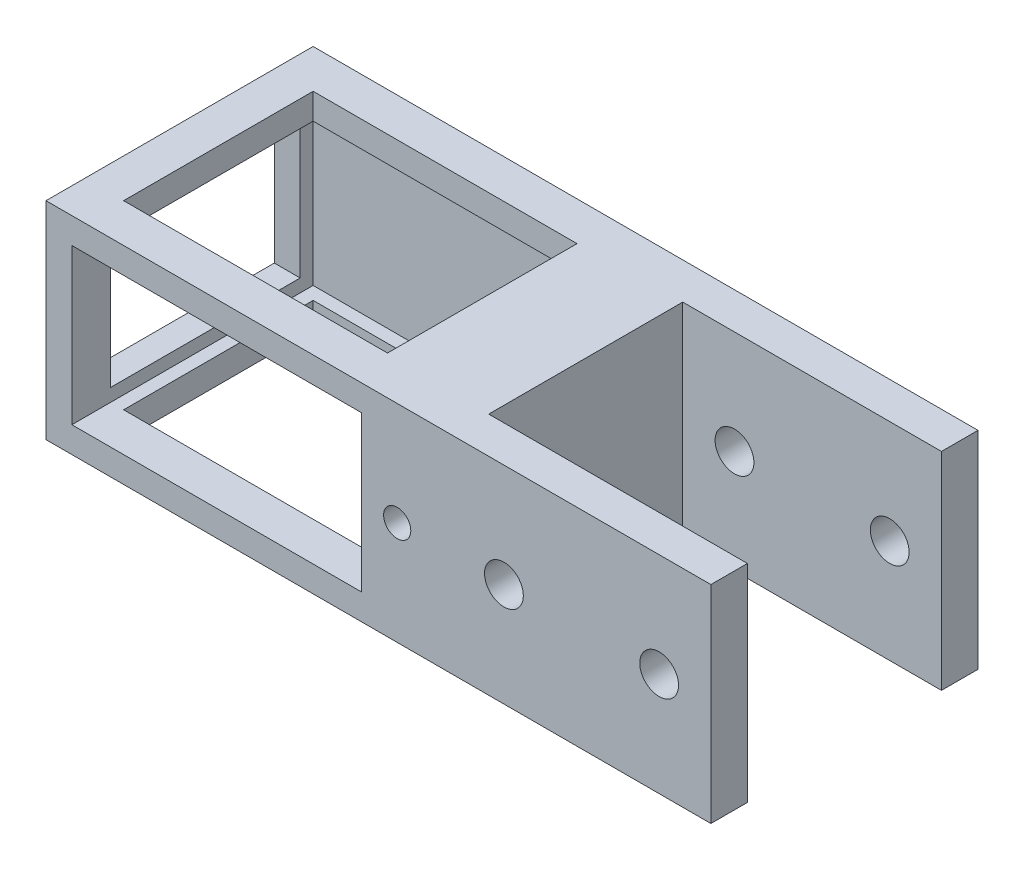
ISO-10303-21;
HEADER;
FILE_DESCRIPTION(('STEP AP214'),'2;1');
FILE_NAME('part.step','',(''),(''),'','','');
FILE_SCHEMA(('AUTOMOTIVE_DESIGN { 1 0 10303 214 1 1 1 1 }'));
ENDSEC;
DATA;
#1=APPLICATION_CONTEXT('core data for automotive mechanical design processes');
#2=APPLICATION_PROTOCOL_DEFINITION('international standard','automotive_design',2000,#1);
#3=PRODUCT_CONTEXT('',#1,'mechanical');
#4=PRODUCT('Part','Part','',(#3));
#5=PRODUCT_RELATED_PRODUCT_CATEGORY('part','',(#4));
#6=PRODUCT_DEFINITION_FORMATION('','',#4);
#7=PRODUCT_DEFINITION_CONTEXT('part definition',#1,'design');
#8=PRODUCT_DEFINITION('design','',#6,#7);
#9=PRODUCT_DEFINITION_SHAPE('','',#8);
#10=(LENGTH_UNIT() NAMED_UNIT(*) SI_UNIT(.MILLI.,.METRE.));
#11=(NAMED_UNIT(*) PLANE_ANGLE_UNIT() SI_UNIT($,.RADIAN.));
#12=(NAMED_UNIT(*) SI_UNIT($,.STERADIAN.) SOLID_ANGLE_UNIT());
#13=UNCERTAINTY_MEASURE_WITH_UNIT(LENGTH_MEASURE(1.E-05),#10,'distance_accuracy_value','');
#14=(GEOMETRIC_REPRESENTATION_CONTEXT(3) GLOBAL_UNCERTAINTY_ASSIGNED_CONTEXT((#13)) GLOBAL_UNIT_ASSIGNED_CONTEXT((#10,
#11,#12)) REPRESENTATION_CONTEXT('',''));
#15=CARTESIAN_POINT('',(0.,0.,0.));
#16=DIRECTION('',(0.,0.,1.));
#17=DIRECTION('',(1.,0.,0.));
#18=AXIS2_PLACEMENT_3D('',#15,#16,#17);
#19=CARTESIAN_POINT('',(18.2,0.,0.));
#20=DIRECTION('',(1.,0.,0.));
#21=DIRECTION('',(0.,0.,-1.));
#22=AXIS2_PLACEMENT_3D('',#19,#20,#21);
#23=PLANE('',#22);
#24=DIRECTION('',(0.,0.,1.));
#25=VECTOR('',#24,1.);
#26=CARTESIAN_POINT('',(18.2,8.,20.65));
#27=LINE('',#26,#25);
#28=CARTESIAN_POINT('',(18.2,8.,2.825));
#29=VERTEX_POINT('',#28);
#30=CARTESIAN_POINT('',(18.2,8.,17.825));
#31=VERTEX_POINT('',#30);
#32=EDGE_CURVE('E59',#29,#31,#27,.T.);
#33=ORIENTED_EDGE('',*,*,#32,.T.);
#34=DIRECTION('',(0.,1.,0.));
#35=VECTOR('',#34,1.);
#36=CARTESIAN_POINT('',(18.2,8.,17.825));
#37=LINE('',#36,#35);
#38=CARTESIAN_POINT('',(18.2,-8.,17.825));
#39=VERTEX_POINT('',#38);
#40=EDGE_CURVE('E54',#39,#31,#37,.T.);
#41=ORIENTED_EDGE('',*,*,#40,.F.);
#42=DIRECTION('',(0.,0.,-1.));
#43=VECTOR('',#42,1.);
#44=CARTESIAN_POINT('',(18.2,-8.,20.65));
#45=LINE('',#44,#43);
#46=CARTESIAN_POINT('',(18.2,-8.,2.825));
#47=VERTEX_POINT('',#46);
#48=EDGE_CURVE('E254',#39,#47,#45,.T.);
#49=ORIENTED_EDGE('',*,*,#48,.T.);
#50=DIRECTION('',(0.,-1.,0.));
#51=VECTOR('',#50,1.);
#52=CARTESIAN_POINT('',(18.2,8.,2.825));
#53=LINE('',#52,#51);
#54=EDGE_CURVE('E235',#29,#47,#53,.T.);
#55=ORIENTED_EDGE('',*,*,#54,.F.);
#56=EDGE_LOOP('',(#33,#41,#49,#55));
#57=FACE_BOUND('',#56,.T.);
#58=ADVANCED_FACE('F37',(#57),#23,.T.);
#59=CARTESIAN_POINT('',(0.,0.,20.65));
#60=DIRECTION('',(0.,0.,1.));
#61=DIRECTION('',(1.,0.,0.));
#62=AXIS2_PLACEMENT_3D('',#59,#60,#61);
#63=PLANE('',#62);
#64=CARTESIAN_POINT('',(34.2,0.,20.65));
#65=DIRECTION('',(0.,0.,1.));
#66=DIRECTION('',(1.,0.,0.));
#67=AXIS2_PLACEMENT_3D('',#64,#65,#66);
#68=CIRCLE('',#67,1.5);
#69=CARTESIAN_POINT('',(35.7,0.,20.65));
#70=VERTEX_POINT('',#69);
#71=EDGE_CURVE('E224',#70,#70,#68,.T.);
#72=ORIENTED_EDGE('',*,*,#71,.F.);
#73=EDGE_LOOP('',(#72));
#74=FACE_BOUND('',#73,.T.);
#75=CARTESIAN_POINT('',(22.2,0.,20.65));
#76=DIRECTION('',(0.,0.,1.));
#77=DIRECTION('',(1.,0.,0.));
#78=AXIS2_PLACEMENT_3D('',#75,#76,#77);
#79=CIRCLE('',#78,1.5);
#80=CARTESIAN_POINT('',(23.7,0.,20.65));
#81=VERTEX_POINT('',#80);
#82=EDGE_CURVE('E413',#81,#81,#79,.T.);
#83=ORIENTED_EDGE('',*,*,#82,.F.);
#84=EDGE_LOOP('',(#83));
#85=FACE_BOUND('',#84,.T.);
#86=CARTESIAN_POINT('',(13.95,0.,20.65));
#87=DIRECTION('',(0.,0.,1.));
#88=DIRECTION('',(1.,0.,0.));
#89=AXIS2_PLACEMENT_3D('',#86,#87,#88);
#90=CIRCLE('',#89,1.05);
#91=CARTESIAN_POINT('',(15.,0.,20.65));
#92=VERTEX_POINT('',#91);
#93=EDGE_CURVE('E263',#92,#92,#90,.T.);
#94=ORIENTED_EDGE('',*,*,#93,.F.);
#95=EDGE_LOOP('',(#94));
#96=FACE_BOUND('',#95,.T.);
#97=DIRECTION('',(0.,1.,0.));
#98=VECTOR('',#97,1.);
#99=CARTESIAN_POINT('',(11.2,6.,20.65));
#100=LINE('',#99,#98);
#101=CARTESIAN_POINT('',(11.2,-6.,20.65));
#102=VERTEX_POINT('',#101);
#103=CARTESIAN_POINT('',(11.2,6.,20.65));
#104=VERTEX_POINT('',#103);
#105=EDGE_CURVE('E337',#102,#104,#100,.T.);
#106=ORIENTED_EDGE('',*,*,#105,.F.);
#107=DIRECTION('',(1.,0.,0.));
#108=VECTOR('',#107,1.);
#109=CARTESIAN_POINT('',(-11.2,-6.,20.65));
#110=LINE('',#109,#108);
#111=CARTESIAN_POINT('',(-11.2,-6.,20.65));
#112=VERTEX_POINT('',#111);
#113=EDGE_CURVE('E342',#112,#102,#110,.T.);
#114=ORIENTED_EDGE('',*,*,#113,.F.);
#115=DIRECTION('',(0.,-1.,0.));
#116=VECTOR('',#115,1.);
#117=CARTESIAN_POINT('',(-11.2,6.,20.65));
#118=LINE('',#117,#116);
#119=CARTESIAN_POINT('',(-11.2,6.,20.65));
#120=VERTEX_POINT('',#119);
#121=EDGE_CURVE('E356',#120,#112,#118,.T.);
#122=ORIENTED_EDGE('',*,*,#121,.F.);
#123=DIRECTION('',(-1.,0.,0.));
#124=VECTOR('',#123,1.);
#125=CARTESIAN_POINT('',(-11.2,6.,20.65));
#126=LINE('',#125,#124);
#127=EDGE_CURVE('E353',#104,#120,#126,.T.);
#128=ORIENTED_EDGE('',*,*,#127,.F.);
#129=EDGE_LOOP('',(#106,#114,#122,#128));
#130=FACE_BOUND('',#129,.T.);
#131=DIRECTION('',(1.,0.,0.));
#132=VECTOR('',#131,1.);
#133=CARTESIAN_POINT('',(-13.2,-8.,20.65));
#134=LINE('',#133,#132);
#135=CARTESIAN_POINT('',(-13.2,-8.,20.65));
#136=VERTEX_POINT('',#135);
#137=CARTESIAN_POINT('',(38.2,-8.,20.65));
#138=VERTEX_POINT('',#137);
#139=EDGE_CURVE('E198',#136,#138,#134,.T.);
#140=ORIENTED_EDGE('',*,*,#139,.T.);
#141=DIRECTION('',(0.,-1.,0.));
#142=VECTOR('',#141,1.);
#143=CARTESIAN_POINT('',(38.2,8.,20.65));
#144=LINE('',#143,#142);
#145=CARTESIAN_POINT('',(38.2,8.,20.65));
#146=VERTEX_POINT('',#145);
#147=EDGE_CURVE('E202',#146,#138,#144,.T.);
#148=ORIENTED_EDGE('',*,*,#147,.F.);
#149=DIRECTION('',(-1.,0.,0.));
#150=VECTOR('',#149,1.);
#151=CARTESIAN_POINT('',(-13.2,8.,20.65));
#152=LINE('',#151,#150);
#153=CARTESIAN_POINT('',(-13.2,8.,20.65));
#154=VERTEX_POINT('',#153);
#155=EDGE_CURVE('E370',#146,#154,#152,.T.);
#156=ORIENTED_EDGE('',*,*,#155,.T.);
#157=DIRECTION('',(0.,-1.,0.));
#158=VECTOR('',#157,1.);
#159=CARTESIAN_POINT('',(-13.2,8.,20.65));
#160=LINE('',#159,#158);
#161=EDGE_CURVE('E204',#154,#136,#160,.T.);
#162=ORIENTED_EDGE('',*,*,#161,.T.);
#163=EDGE_LOOP('',(#140,#148,#156,#162));
#164=FACE_BOUND('',#163,.T.);
#165=ADVANCED_FACE('F200',(#74,#85,#96,#130,#164),#63,.T.);
#166=CARTESIAN_POINT('',(0.,0.,0.));
#167=DIRECTION('',(0.,0.,1.));
#168=DIRECTION('',(1.,0.,0.));
#169=AXIS2_PLACEMENT_3D('',#166,#167,#168);
#170=PLANE('',#169);
#171=CARTESIAN_POINT('',(34.2,0.,0.));
#172=DIRECTION('',(0.,0.,-1.));
#173=DIRECTION('',(-1.,0.,0.));
#174=AXIS2_PLACEMENT_3D('',#171,#172,#173);
#175=CIRCLE('',#174,1.5);
#176=CARTESIAN_POINT('',(32.7,0.,0.));
#177=VERTEX_POINT('',#176);
#178=EDGE_CURVE('E409',#177,#177,#175,.T.);
#179=ORIENTED_EDGE('',*,*,#178,.F.);
#180=EDGE_LOOP('',(#179));
#181=FACE_BOUND('',#180,.T.);
#182=CARTESIAN_POINT('',(22.2,0.,0.));
#183=DIRECTION('',(0.,0.,-1.));
#184=DIRECTION('',(-1.,0.,0.));
#185=AXIS2_PLACEMENT_3D('',#182,#183,#184);
#186=CIRCLE('',#185,1.5);
#187=CARTESIAN_POINT('',(20.7,0.,0.));
#188=VERTEX_POINT('',#187);
#189=EDGE_CURVE('E416',#188,#188,#186,.T.);
#190=ORIENTED_EDGE('',*,*,#189,.F.);
#191=EDGE_LOOP('',(#190));
#192=FACE_BOUND('',#191,.T.);
#193=CARTESIAN_POINT('',(-5.2,0.,0.));
#194=DIRECTION('',(0.,0.,1.));
#195=DIRECTION('',(1.,0.,0.));
#196=AXIS2_PLACEMENT_3D('',#193,#194,#195);
#197=CIRCLE('',#196,5.);
#198=CARTESIAN_POINT('',(-0.2,0.,0.));
#199=VERTEX_POINT('',#198);
#200=EDGE_CURVE('E46',#199,#199,#197,.F.);
#201=ORIENTED_EDGE('',*,*,#200,.F.);
#202=EDGE_LOOP('',(#201));
#203=FACE_BOUND('',#202,.T.);
#204=DIRECTION('',(-1.,0.,0.));
#205=VECTOR('',#204,1.);
#206=CARTESIAN_POINT('',(-13.2,8.,0.));
#207=LINE('',#206,#205);
#208=CARTESIAN_POINT('',(38.2,8.,0.));
#209=VERTEX_POINT('',#208);
#210=CARTESIAN_POINT('',(-13.2,8.,0.));
#211=VERTEX_POINT('',#210);
#212=EDGE_CURVE('E363',#209,#211,#207,.T.);
#213=ORIENTED_EDGE('',*,*,#212,.F.);
#214=DIRECTION('',(0.,1.,0.));
#215=VECTOR('',#214,1.);
#216=CARTESIAN_POINT('',(38.2,8.,0.));
#217=LINE('',#216,#215);
#218=CARTESIAN_POINT('',(38.2,-8.,0.));
#219=VERTEX_POINT('',#218);
#220=EDGE_CURVE('E236',#219,#209,#217,.T.);
#221=ORIENTED_EDGE('',*,*,#220,.F.);
#222=DIRECTION('',(1.,0.,0.));
#223=VECTOR('',#222,1.);
#224=CARTESIAN_POINT('',(-13.2,-8.,0.));
#225=LINE('',#224,#223);
#226=CARTESIAN_POINT('',(-13.2,-8.,0.));
#227=VERTEX_POINT('',#226);
#228=EDGE_CURVE('E372',#227,#219,#225,.T.);
#229=ORIENTED_EDGE('',*,*,#228,.F.);
#230=DIRECTION('',(0.,-1.,0.));
#231=VECTOR('',#230,1.);
#232=CARTESIAN_POINT('',(-13.2,8.,0.));
#233=LINE('',#232,#231);
#234=EDGE_CURVE('E375',#211,#227,#233,.T.);
#235=ORIENTED_EDGE('',*,*,#234,.F.);
#236=EDGE_LOOP('',(#213,#221,#229,#235));
#237=FACE_BOUND('',#236,.T.);
#238=ADVANCED_FACE('F454',(#181,#192,#203,#237),#170,.F.);
#239=CARTESIAN_POINT('',(-13.2,8.,20.65));
#240=DIRECTION('',(0.,-1.,0.));
#241=DIRECTION('',(0.,0.,-1.));
#242=AXIS2_PLACEMENT_3D('',#239,#240,#241);
#243=PLANE('',#242);
#244=DIRECTION('',(-1.,0.,0.));
#245=VECTOR('',#244,1.);
#246=CARTESIAN_POINT('',(10.2,8.,3.));
#247=LINE('',#246,#245);
#248=CARTESIAN_POINT('',(10.2,8.,3.));
#249=VERTEX_POINT('',#248);
#250=CARTESIAN_POINT('',(-10.2,8.,3.00000000000001));
#251=VERTEX_POINT('',#250);
#252=EDGE_CURVE('E291',#249,#251,#247,.T.);
#253=ORIENTED_EDGE('',*,*,#252,.F.);
#254=DIRECTION('',(0.,0.,-1.));
#255=VECTOR('',#254,1.);
#256=CARTESIAN_POINT('',(10.2,8.,17.65));
#257=LINE('',#256,#255);
#258=CARTESIAN_POINT('',(10.2,8.,17.65));
#259=VERTEX_POINT('',#258);
#260=EDGE_CURVE('E283',#259,#249,#257,.T.);
#261=ORIENTED_EDGE('',*,*,#260,.F.);
#262=DIRECTION('',(1.,0.,0.));
#263=VECTOR('',#262,1.);
#264=CARTESIAN_POINT('',(10.2,8.,17.65));
#265=LINE('',#264,#263);
#266=CARTESIAN_POINT('',(-10.2,8.,17.65));
#267=VERTEX_POINT('',#266);
#268=EDGE_CURVE('E297',#267,#259,#265,.T.);
#269=ORIENTED_EDGE('',*,*,#268,.F.);
#270=DIRECTION('',(0.,0.,1.));
#271=VECTOR('',#270,1.);
#272=CARTESIAN_POINT('',(-10.2,8.,17.65));
#273=LINE('',#272,#271);
#274=EDGE_CURVE('E294',#251,#267,#273,.T.);
#275=ORIENTED_EDGE('',*,*,#274,.F.);
#276=EDGE_LOOP('',(#253,#261,#269,#275));
#277=FACE_BOUND('',#276,.T.);
#278=ORIENTED_EDGE('',*,*,#32,.F.);
#279=DIRECTION('',(-1.,0.,0.));
#280=VECTOR('',#279,1.);
#281=CARTESIAN_POINT('',(38.2,8.,2.825));
#282=LINE('',#281,#280);
#283=CARTESIAN_POINT('',(38.2,8.,2.825));
#284=VERTEX_POINT('',#283);
#285=EDGE_CURVE('E251',#284,#29,#282,.T.);
#286=ORIENTED_EDGE('',*,*,#285,.F.);
#287=DIRECTION('',(0.,0.,1.));
#288=VECTOR('',#287,1.);
#289=CARTESIAN_POINT('',(38.2,8.,0.));
#290=LINE('',#289,#288);
#291=EDGE_CURVE('E239',#209,#284,#290,.T.);
#292=ORIENTED_EDGE('',*,*,#291,.F.);
#293=ORIENTED_EDGE('',*,*,#212,.T.);
#294=DIRECTION('',(0.,0.,-1.));
#295=VECTOR('',#294,1.);
#296=CARTESIAN_POINT('',(-13.2,8.,20.65));
#297=LINE('',#296,#295);
#298=EDGE_CURVE('E379',#154,#211,#297,.T.);
#299=ORIENTED_EDGE('',*,*,#298,.F.);
#300=ORIENTED_EDGE('',*,*,#155,.F.);
#301=DIRECTION('',(0.,0.,1.));
#302=VECTOR('',#301,1.);
#303=CARTESIAN_POINT('',(38.2,8.,20.65));
#304=LINE('',#303,#302);
#305=CARTESIAN_POINT('',(38.2,8.,17.825));
#306=VERTEX_POINT('',#305);
#307=EDGE_CURVE('E222',#306,#146,#304,.T.);
#308=ORIENTED_EDGE('',*,*,#307,.F.);
#309=DIRECTION('',(-1.,0.,0.));
#310=VECTOR('',#309,1.);
#311=CARTESIAN_POINT('',(38.2,8.,17.825));
#312=LINE('',#311,#310);
#313=EDGE_CURVE('E230',#306,#31,#312,.T.);
#314=ORIENTED_EDGE('',*,*,#313,.T.);
#315=EDGE_LOOP('',(#278,#286,#292,#293,#299,#300,#308,#314));
#316=FACE_BOUND('',#315,.T.);
#317=ADVANCED_FACE('F39',(#277,#316),#243,.F.);
#318=CARTESIAN_POINT('',(-13.2,-8.,20.65));
#319=DIRECTION('',(0.,1.,0.));
#320=DIRECTION('',(0.,0.,1.));
#321=AXIS2_PLACEMENT_3D('',#318,#319,#320);
#322=PLANE('',#321);
#323=DIRECTION('',(1.,0.,0.));
#324=VECTOR('',#323,1.);
#325=CARTESIAN_POINT('',(-13.2,-8.,17.65));
#326=LINE('',#325,#324);
#327=CARTESIAN_POINT('',(-10.2,-8.,17.65));
#328=VERTEX_POINT('',#327);
#329=CARTESIAN_POINT('',(10.2,-8.,17.65));
#330=VERTEX_POINT('',#329);
#331=EDGE_CURVE('E328',#328,#330,#326,.T.);
#332=ORIENTED_EDGE('',*,*,#331,.T.);
#333=DIRECTION('',(0.,0.,-1.));
#334=VECTOR('',#333,1.);
#335=CARTESIAN_POINT('',(10.2,-8.,20.65));
#336=LINE('',#335,#334);
#337=CARTESIAN_POINT('',(10.2,-8.,3.));
#338=VERTEX_POINT('',#337);
#339=EDGE_CURVE('E334',#330,#338,#336,.T.);
#340=ORIENTED_EDGE('',*,*,#339,.T.);
#341=DIRECTION('',(-1.,0.,0.));
#342=VECTOR('',#341,1.);
#343=CARTESIAN_POINT('',(-13.2,-8.,3.00000000000001));
#344=LINE('',#343,#342);
#345=CARTESIAN_POINT('',(-10.2,-8.,3.00000000000001));
#346=VERTEX_POINT('',#345);
#347=EDGE_CURVE('E316',#338,#346,#344,.T.);
#348=ORIENTED_EDGE('',*,*,#347,.T.);
#349=DIRECTION('',(0.,0.,1.));
#350=VECTOR('',#349,1.);
#351=CARTESIAN_POINT('',(-10.2,-8.,20.65));
#352=LINE('',#351,#350);
#353=EDGE_CURVE('E322',#346,#328,#352,.T.);
#354=ORIENTED_EDGE('',*,*,#353,.T.);
#355=EDGE_LOOP('',(#332,#340,#348,#354));
#356=FACE_BOUND('',#355,.T.);
#357=ORIENTED_EDGE('',*,*,#48,.F.);
#358=DIRECTION('',(-1.,0.,0.));
#359=VECTOR('',#358,1.);
#360=CARTESIAN_POINT('',(38.2,-8.,17.825));
#361=LINE('',#360,#359);
#362=CARTESIAN_POINT('',(38.2,-8.,17.825));
#363=VERTEX_POINT('',#362);
#364=EDGE_CURVE('E214',#363,#39,#361,.T.);
#365=ORIENTED_EDGE('',*,*,#364,.F.);
#366=DIRECTION('',(0.,0.,-1.));
#367=VECTOR('',#366,1.);
#368=CARTESIAN_POINT('',(38.2,-8.,20.65));
#369=LINE('',#368,#367);
#370=EDGE_CURVE('E211',#138,#363,#369,.T.);
#371=ORIENTED_EDGE('',*,*,#370,.F.);
#372=ORIENTED_EDGE('',*,*,#139,.F.);
#373=DIRECTION('',(0.,0.,-1.));
#374=VECTOR('',#373,1.);
#375=CARTESIAN_POINT('',(-13.2,-8.,20.65));
#376=LINE('',#375,#374);
#377=EDGE_CURVE('E208',#136,#227,#376,.T.);
#378=ORIENTED_EDGE('',*,*,#377,.T.);
#379=ORIENTED_EDGE('',*,*,#228,.T.);
#380=DIRECTION('',(0.,0.,-1.));
#381=VECTOR('',#380,1.);
#382=CARTESIAN_POINT('',(38.2,-8.,0.));
#383=LINE('',#382,#381);
#384=CARTESIAN_POINT('',(38.2,-8.,2.825));
#385=VERTEX_POINT('',#384);
#386=EDGE_CURVE('E243',#385,#219,#383,.T.);
#387=ORIENTED_EDGE('',*,*,#386,.F.);
#388=DIRECTION('',(-1.,0.,0.));
#389=VECTOR('',#388,1.);
#390=CARTESIAN_POINT('',(38.2,-8.,2.825));
#391=LINE('',#390,#389);
#392=EDGE_CURVE('E246',#385,#47,#391,.T.);
#393=ORIENTED_EDGE('',*,*,#392,.T.);
#394=EDGE_LOOP('',(#357,#365,#371,#372,#378,#379,#387,#393));
#395=FACE_BOUND('',#394,.T.);
#396=ADVANCED_FACE('F212',(#356,#395),#322,.F.);
#397=CARTESIAN_POINT('',(-13.2,8.,20.65));
#398=DIRECTION('',(1.,0.,0.));
#399=DIRECTION('',(0.,1.,0.));
#400=AXIS2_PLACEMENT_3D('',#397,#398,#399);
#401=PLANE('',#400);
#402=DIRECTION('',(0.,0.,1.));
#403=VECTOR('',#402,1.);
#404=CARTESIAN_POINT('',(-13.2,-5.,0.));
#405=LINE('',#404,#403);
#406=CARTESIAN_POINT('',(-13.2,-5.,3.));
#407=VERTEX_POINT('',#406);
#408=CARTESIAN_POINT('',(-13.2,-5.,17.65));
#409=VERTEX_POINT('',#408);
#410=EDGE_CURVE('E271',#407,#409,#405,.T.);
#411=ORIENTED_EDGE('',*,*,#410,.F.);
#412=DIRECTION('',(0.,-1.,0.));
#413=VECTOR('',#412,1.);
#414=CARTESIAN_POINT('',(-13.2,0.,3.));
#415=LINE('',#414,#413);
#416=CARTESIAN_POINT('',(-13.2,5.,3.));
#417=VERTEX_POINT('',#416);
#418=EDGE_CURVE('E267',#417,#407,#415,.T.);
#419=ORIENTED_EDGE('',*,*,#418,.F.);
#420=DIRECTION('',(0.,0.,1.));
#421=VECTOR('',#420,1.);
#422=CARTESIAN_POINT('',(-13.2,5.,0.));
#423=LINE('',#422,#421);
#424=CARTESIAN_POINT('',(-13.2,5.,17.65));
#425=VERTEX_POINT('',#424);
#426=EDGE_CURVE('E277',#417,#425,#423,.T.);
#427=ORIENTED_EDGE('',*,*,#426,.T.);
#428=DIRECTION('',(0.,-1.,0.));
#429=VECTOR('',#428,1.);
#430=CARTESIAN_POINT('',(-13.2,0.,17.65));
#431=LINE('',#430,#429);
#432=EDGE_CURVE('E274',#425,#409,#431,.T.);
#433=ORIENTED_EDGE('',*,*,#432,.T.);
#434=EDGE_LOOP('',(#411,#419,#427,#433));
#435=FACE_BOUND('',#434,.T.);
#436=ORIENTED_EDGE('',*,*,#234,.T.);
#437=ORIENTED_EDGE('',*,*,#377,.F.);
#438=ORIENTED_EDGE('',*,*,#161,.F.);
#439=ORIENTED_EDGE('',*,*,#298,.T.);
#440=EDGE_LOOP('',(#436,#437,#438,#439));
#441=FACE_BOUND('',#440,.T.);
#442=ADVANCED_FACE('F539',(#435,#441),#401,.F.);
#443=CARTESIAN_POINT('',(11.2,6.,2.));
#444=DIRECTION('',(1.,0.,0.));
#445=DIRECTION('',(0.,0.,-1.));
#446=AXIS2_PLACEMENT_3D('',#443,#444,#445);
#447=PLANE('',#446);
#448=ORIENTED_EDGE('',*,*,#105,.T.);
#449=DIRECTION('',(0.,0.,1.));
#450=VECTOR('',#449,1.);
#451=CARTESIAN_POINT('',(11.2,6.,2.));
#452=LINE('',#451,#450);
#453=CARTESIAN_POINT('',(11.2,6.,2.));
#454=VERTEX_POINT('',#453);
#455=EDGE_CURVE('E351',#454,#104,#452,.T.);
#456=ORIENTED_EDGE('',*,*,#455,.F.);
#457=DIRECTION('',(0.,1.,0.));
#458=VECTOR('',#457,1.);
#459=CARTESIAN_POINT('',(11.2,6.,2.));
#460=LINE('',#459,#458);
#461=CARTESIAN_POINT('',(11.2,-6.,2.));
#462=VERTEX_POINT('',#461);
#463=EDGE_CURVE('E338',#462,#454,#460,.T.);
#464=ORIENTED_EDGE('',*,*,#463,.F.);
#465=DIRECTION('',(0.,0.,1.));
#466=VECTOR('',#465,1.);
#467=CARTESIAN_POINT('',(11.2,-6.,2.));
#468=LINE('',#467,#466);
#469=EDGE_CURVE('E361',#462,#102,#468,.T.);
#470=ORIENTED_EDGE('',*,*,#469,.T.);
#471=EDGE_LOOP('',(#448,#456,#464,#470));
#472=FACE_BOUND('',#471,.T.);
#473=ADVANCED_FACE('F530',(#472),#447,.F.);
#474=CARTESIAN_POINT('',(-11.2,-6.,2.));
#475=DIRECTION('',(0.,-1.,0.));
#476=DIRECTION('',(0.,0.,-1.));
#477=AXIS2_PLACEMENT_3D('',#474,#475,#476);
#478=PLANE('',#477);
#479=DIRECTION('',(1.,0.,0.));
#480=VECTOR('',#479,1.);
#481=CARTESIAN_POINT('',(-11.2,-6.,3.00000000000001));
#482=LINE('',#481,#480);
#483=CARTESIAN_POINT('',(-10.2,-6.,3.00000000000001));
#484=VERTEX_POINT('',#483);
#485=CARTESIAN_POINT('',(10.2,-6.,3.));
#486=VERTEX_POINT('',#485);
#487=EDGE_CURVE('E313',#484,#486,#482,.T.);
#488=ORIENTED_EDGE('',*,*,#487,.T.);
#489=DIRECTION('',(0.,0.,1.));
#490=VECTOR('',#489,1.);
#491=CARTESIAN_POINT('',(10.2,-6.,2.));
#492=LINE('',#491,#490);
#493=CARTESIAN_POINT('',(10.2,-6.,17.65));
#494=VERTEX_POINT('',#493);
#495=EDGE_CURVE('E331',#486,#494,#492,.T.);
#496=ORIENTED_EDGE('',*,*,#495,.T.);
#497=DIRECTION('',(-1.,0.,0.));
#498=VECTOR('',#497,1.);
#499=CARTESIAN_POINT('',(-11.2,-6.,17.65));
#500=LINE('',#499,#498);
#501=CARTESIAN_POINT('',(-10.2,-6.,17.65));
#502=VERTEX_POINT('',#501);
#503=EDGE_CURVE('E325',#494,#502,#500,.T.);
#504=ORIENTED_EDGE('',*,*,#503,.T.);
#505=DIRECTION('',(0.,0.,-1.));
#506=VECTOR('',#505,1.);
#507=CARTESIAN_POINT('',(-10.2,-6.,2.));
#508=LINE('',#507,#506);
#509=EDGE_CURVE('E319',#502,#484,#508,.T.);
#510=ORIENTED_EDGE('',*,*,#509,.T.);
#511=EDGE_LOOP('',(#488,#496,#504,#510));
#512=FACE_BOUND('',#511,.T.);
#513=ORIENTED_EDGE('',*,*,#113,.T.);
#514=ORIENTED_EDGE('',*,*,#469,.F.);
#515=DIRECTION('',(1.,0.,0.));
#516=VECTOR('',#515,1.);
#517=CARTESIAN_POINT('',(-11.2,-6.,2.));
#518=LINE('',#517,#516);
#519=CARTESIAN_POINT('',(-11.2,-6.,2.));
#520=VERTEX_POINT('',#519);
#521=EDGE_CURVE('E348',#520,#462,#518,.T.);
#522=ORIENTED_EDGE('',*,*,#521,.F.);
#523=DIRECTION('',(0.,0.,1.));
#524=VECTOR('',#523,1.);
#525=CARTESIAN_POINT('',(-11.2,-6.,2.));
#526=LINE('',#525,#524);
#527=EDGE_CURVE('E364',#520,#112,#526,.T.);
#528=ORIENTED_EDGE('',*,*,#527,.T.);
#529=EDGE_LOOP('',(#513,#514,#522,#528));
#530=FACE_BOUND('',#529,.T.);
#531=ADVANCED_FACE('F526',(#512,#530),#478,.F.);
#532=CARTESIAN_POINT('',(-11.2,6.,2.));
#533=DIRECTION('',(-1.,0.,0.));
#534=DIRECTION('',(0.,-1.,0.));
#535=AXIS2_PLACEMENT_3D('',#532,#533,#534);
#536=PLANE('',#535);
#537=DIRECTION('',(0.,0.,1.));
#538=VECTOR('',#537,1.);
#539=CARTESIAN_POINT('',(-11.2,5.,2.));
#540=LINE('',#539,#538);
#541=CARTESIAN_POINT('',(-11.2,5.,3.));
#542=VERTEX_POINT('',#541);
#543=CARTESIAN_POINT('',(-11.2,5.,17.65));
#544=VERTEX_POINT('',#543);
#545=EDGE_CURVE('E400',#542,#544,#540,.T.);
#546=ORIENTED_EDGE('',*,*,#545,.F.);
#547=DIRECTION('',(0.,-1.,0.));
#548=VECTOR('',#547,1.);
#549=CARTESIAN_POINT('',(-11.2,6.,3.));
#550=LINE('',#549,#548);
#551=CARTESIAN_POINT('',(-11.2,-5.,3.));
#552=VERTEX_POINT('',#551);
#553=EDGE_CURVE('E402',#542,#552,#550,.T.);
#554=ORIENTED_EDGE('',*,*,#553,.T.);
#555=DIRECTION('',(0.,0.,1.));
#556=VECTOR('',#555,1.);
#557=CARTESIAN_POINT('',(-11.2,-5.,2.));
#558=LINE('',#557,#556);
#559=CARTESIAN_POINT('',(-11.2,-5.,17.65));
#560=VERTEX_POINT('',#559);
#561=EDGE_CURVE('E394',#552,#560,#558,.T.);
#562=ORIENTED_EDGE('',*,*,#561,.T.);
#563=DIRECTION('',(0.,-1.,0.));
#564=VECTOR('',#563,1.);
#565=CARTESIAN_POINT('',(-11.2,6.,17.65));
#566=LINE('',#565,#564);
#567=EDGE_CURVE('E397',#544,#560,#566,.T.);
#568=ORIENTED_EDGE('',*,*,#567,.F.);
#569=EDGE_LOOP('',(#546,#554,#562,#568));
#570=FACE_BOUND('',#569,.T.);
#571=ORIENTED_EDGE('',*,*,#121,.T.);
#572=ORIENTED_EDGE('',*,*,#527,.F.);
#573=DIRECTION('',(0.,-1.,0.));
#574=VECTOR('',#573,1.);
#575=CARTESIAN_POINT('',(-11.2,6.,2.));
#576=LINE('',#575,#574);
#577=CARTESIAN_POINT('',(-11.2,6.,2.));
#578=VERTEX_POINT('',#577);
#579=EDGE_CURVE('E345',#578,#520,#576,.T.);
#580=ORIENTED_EDGE('',*,*,#579,.F.);
#581=DIRECTION('',(0.,0.,1.));
#582=VECTOR('',#581,1.);
#583=CARTESIAN_POINT('',(-11.2,6.,2.));
#584=LINE('',#583,#582);
#585=EDGE_CURVE('E366',#578,#120,#584,.T.);
#586=ORIENTED_EDGE('',*,*,#585,.T.);
#587=EDGE_LOOP('',(#571,#572,#580,#586));
#588=FACE_BOUND('',#587,.T.);
#589=ADVANCED_FACE('F529',(#570,#588),#536,.F.);
#590=CARTESIAN_POINT('',(-11.2,6.,2.));
#591=DIRECTION('',(0.,1.,0.));
#592=DIRECTION('',(0.,0.,1.));
#593=AXIS2_PLACEMENT_3D('',#590,#591,#592);
#594=PLANE('',#593);
#595=DIRECTION('',(1.,0.,0.));
#596=VECTOR('',#595,1.);
#597=CARTESIAN_POINT('',(-11.2,6.,17.65));
#598=LINE('',#597,#596);
#599=CARTESIAN_POINT('',(-10.2,6.,17.65));
#600=VERTEX_POINT('',#599);
#601=CARTESIAN_POINT('',(10.2,6.,17.65));
#602=VERTEX_POINT('',#601);
#603=EDGE_CURVE('E388',#600,#602,#598,.T.);
#604=ORIENTED_EDGE('',*,*,#603,.T.);
#605=DIRECTION('',(0.,0.,-1.));
#606=VECTOR('',#605,1.);
#607=CARTESIAN_POINT('',(10.2,6.,2.));
#608=LINE('',#607,#606);
#609=CARTESIAN_POINT('',(10.2,6.,3.));
#610=VERTEX_POINT('',#609);
#611=EDGE_CURVE('E391',#602,#610,#608,.T.);
#612=ORIENTED_EDGE('',*,*,#611,.T.);
#613=DIRECTION('',(-1.,0.,0.));
#614=VECTOR('',#613,1.);
#615=CARTESIAN_POINT('',(-11.2,6.,3.00000000000001));
#616=LINE('',#615,#614);
#617=CARTESIAN_POINT('',(-10.2,6.,3.00000000000001));
#618=VERTEX_POINT('',#617);
#619=EDGE_CURVE('E382',#610,#618,#616,.T.);
#620=ORIENTED_EDGE('',*,*,#619,.T.);
#621=DIRECTION('',(0.,0.,1.));
#622=VECTOR('',#621,1.);
#623=CARTESIAN_POINT('',(-10.2,6.,2.));
#624=LINE('',#623,#622);
#625=EDGE_CURVE('E385',#618,#600,#624,.T.);
#626=ORIENTED_EDGE('',*,*,#625,.T.);
#627=EDGE_LOOP('',(#604,#612,#620,#626));
#628=FACE_BOUND('',#627,.T.);
#629=ORIENTED_EDGE('',*,*,#127,.T.);
#630=ORIENTED_EDGE('',*,*,#585,.F.);
#631=DIRECTION('',(-1.,0.,0.));
#632=VECTOR('',#631,1.);
#633=CARTESIAN_POINT('',(-11.2,6.,2.));
#634=LINE('',#633,#632);
#635=EDGE_CURVE('E341',#454,#578,#634,.T.);
#636=ORIENTED_EDGE('',*,*,#635,.F.);
#637=ORIENTED_EDGE('',*,*,#455,.T.);
#638=EDGE_LOOP('',(#629,#630,#636,#637));
#639=FACE_BOUND('',#638,.T.);
#640=ADVANCED_FACE('F524',(#628,#639),#594,.F.);
#641=CARTESIAN_POINT('',(0.,0.,2.));
#642=DIRECTION('',(0.,0.,1.));
#643=DIRECTION('',(1.,0.,0.));
#644=AXIS2_PLACEMENT_3D('',#641,#642,#643);
#645=PLANE('',#644);
#646=ORIENTED_EDGE('',*,*,#463,.T.);
#647=ORIENTED_EDGE('',*,*,#635,.T.);
#648=ORIENTED_EDGE('',*,*,#579,.T.);
#649=ORIENTED_EDGE('',*,*,#521,.T.);
#650=EDGE_LOOP('',(#646,#647,#648,#649));
#651=FACE_BOUND('',#650,.T.);
#652=ADVANCED_FACE('F521',(#651),#645,.T.);
#653=CARTESIAN_POINT('',(10.2,-30.65,3.));
#654=DIRECTION('',(0.,0.,-1.));
#655=DIRECTION('',(-1.,0.,0.));
#656=AXIS2_PLACEMENT_3D('',#653,#654,#655);
#657=PLANE('',#656);
#658=DIRECTION('',(0.,1.,0.));
#659=VECTOR('',#658,1.);
#660=CARTESIAN_POINT('',(10.2,-30.65,3.));
#661=LINE('',#660,#659);
#662=EDGE_CURVE('E300',#610,#249,#661,.T.);
#663=ORIENTED_EDGE('',*,*,#662,.T.);
#664=ORIENTED_EDGE('',*,*,#252,.T.);
#665=DIRECTION('',(0.,1.,0.));
#666=VECTOR('',#665,1.);
#667=CARTESIAN_POINT('',(-10.2,-30.65,3.00000000000001));
#668=LINE('',#667,#666);
#669=EDGE_CURVE('E308',#618,#251,#668,.T.);
#670=ORIENTED_EDGE('',*,*,#669,.F.);
#671=ORIENTED_EDGE('',*,*,#619,.F.);
#672=EDGE_LOOP('',(#663,#664,#670,#671));
#673=FACE_BOUND('',#672,.T.);
#674=ADVANCED_FACE('F516',(#673),#657,.F.);
#675=CARTESIAN_POINT('',(-10.2,-30.65,17.65));
#676=DIRECTION('',(-1.,0.,0.));
#677=DIRECTION('',(0.,0.,1.));
#678=AXIS2_PLACEMENT_3D('',#675,#676,#677);
#679=PLANE('',#678);
#680=ORIENTED_EDGE('',*,*,#669,.T.);
#681=ORIENTED_EDGE('',*,*,#274,.T.);
#682=DIRECTION('',(0.,1.,0.));
#683=VECTOR('',#682,1.);
#684=CARTESIAN_POINT('',(-10.2,-30.65,17.65));
#685=LINE('',#684,#683);
#686=EDGE_CURVE('E305',#600,#267,#685,.T.);
#687=ORIENTED_EDGE('',*,*,#686,.F.);
#688=ORIENTED_EDGE('',*,*,#625,.F.);
#689=EDGE_LOOP('',(#680,#681,#687,#688));
#690=FACE_BOUND('',#689,.T.);
#691=ADVANCED_FACE('F512',(#690),#679,.F.);
#692=CARTESIAN_POINT('',(10.2,-30.65,17.65));
#693=DIRECTION('',(0.,0.,1.));
#694=DIRECTION('',(1.,0.,0.));
#695=AXIS2_PLACEMENT_3D('',#692,#693,#694);
#696=PLANE('',#695);
#697=ORIENTED_EDGE('',*,*,#686,.T.);
#698=ORIENTED_EDGE('',*,*,#268,.T.);
#699=DIRECTION('',(0.,1.,0.));
#700=VECTOR('',#699,1.);
#701=CARTESIAN_POINT('',(10.2,-30.65,17.65));
#702=LINE('',#701,#700);
#703=EDGE_CURVE('E301',#602,#259,#702,.T.);
#704=ORIENTED_EDGE('',*,*,#703,.F.);
#705=ORIENTED_EDGE('',*,*,#603,.F.);
#706=EDGE_LOOP('',(#697,#698,#704,#705));
#707=FACE_BOUND('',#706,.T.);
#708=ADVANCED_FACE('F508',(#707),#696,.F.);
#709=CARTESIAN_POINT('',(10.2,-30.65,17.65));
#710=DIRECTION('',(1.,0.,0.));
#711=DIRECTION('',(0.,0.,-1.));
#712=AXIS2_PLACEMENT_3D('',#709,#710,#711);
#713=PLANE('',#712);
#714=ORIENTED_EDGE('',*,*,#703,.T.);
#715=ORIENTED_EDGE('',*,*,#260,.T.);
#716=ORIENTED_EDGE('',*,*,#662,.F.);
#717=ORIENTED_EDGE('',*,*,#611,.F.);
#718=EDGE_LOOP('',(#714,#715,#716,#717));
#719=FACE_BOUND('',#718,.T.);
#720=ADVANCED_FACE('F519',(#719),#713,.F.);
#721=EDGE_CURVE('E303',#330,#494,#702,.T.);
#722=ORIENTED_EDGE('',*,*,#721,.T.);
#723=ORIENTED_EDGE('',*,*,#495,.F.);
#724=EDGE_CURVE('E310',#338,#486,#661,.T.);
#725=ORIENTED_EDGE('',*,*,#724,.F.);
#726=ORIENTED_EDGE('',*,*,#339,.F.);
#727=EDGE_LOOP('',(#722,#723,#725,#726));
#728=FACE_BOUND('',#727,.T.);
#729=ADVANCED_FACE('F506',(#728),#713,.F.);
#730=EDGE_CURVE('E304',#328,#502,#685,.T.);
#731=ORIENTED_EDGE('',*,*,#730,.T.);
#732=ORIENTED_EDGE('',*,*,#503,.F.);
#733=ORIENTED_EDGE('',*,*,#721,.F.);
#734=ORIENTED_EDGE('',*,*,#331,.F.);
#735=EDGE_LOOP('',(#731,#732,#733,#734));
#736=FACE_BOUND('',#735,.T.);
#737=ADVANCED_FACE('F502',(#736),#696,.F.);
#738=EDGE_CURVE('E307',#346,#484,#668,.T.);
#739=ORIENTED_EDGE('',*,*,#738,.T.);
#740=ORIENTED_EDGE('',*,*,#509,.F.);
#741=ORIENTED_EDGE('',*,*,#730,.F.);
#742=ORIENTED_EDGE('',*,*,#353,.F.);
#743=EDGE_LOOP('',(#739,#740,#741,#742));
#744=FACE_BOUND('',#743,.T.);
#745=ADVANCED_FACE('F505',(#744),#679,.F.);
#746=ORIENTED_EDGE('',*,*,#724,.T.);
#747=ORIENTED_EDGE('',*,*,#487,.F.);
#748=ORIENTED_EDGE('',*,*,#738,.F.);
#749=ORIENTED_EDGE('',*,*,#347,.F.);
#750=EDGE_LOOP('',(#746,#747,#748,#749));
#751=FACE_BOUND('',#750,.T.);
#752=ADVANCED_FACE('F500',(#751),#657,.F.);
#753=CARTESIAN_POINT('',(-6.2,0.,3.));
#754=DIRECTION('',(0.,0.,-1.));
#755=DIRECTION('',(-1.,0.,0.));
#756=AXIS2_PLACEMENT_3D('',#753,#754,#755);
#757=PLANE('',#756);
#758=DIRECTION('',(-1.,0.,0.));
#759=VECTOR('',#758,1.);
#760=CARTESIAN_POINT('',(-6.2,5.,3.));
#761=LINE('',#760,#759);
#762=EDGE_CURVE('E281',#542,#417,#761,.T.);
#763=ORIENTED_EDGE('',*,*,#762,.T.);
#764=ORIENTED_EDGE('',*,*,#418,.T.);
#765=DIRECTION('',(-1.,0.,0.));
#766=VECTOR('',#765,1.);
#767=CARTESIAN_POINT('',(-6.2,-5.,3.));
#768=LINE('',#767,#766);
#769=EDGE_CURVE('E280',#552,#407,#768,.T.);
#770=ORIENTED_EDGE('',*,*,#769,.F.);
#771=ORIENTED_EDGE('',*,*,#553,.F.);
#772=EDGE_LOOP('',(#763,#764,#770,#771));
#773=FACE_BOUND('',#772,.T.);
#774=ADVANCED_FACE('F490',(#773),#757,.F.);
#775=CARTESIAN_POINT('',(-6.2,5.,0.));
#776=DIRECTION('',(0.,-1.,0.));
#777=DIRECTION('',(1.,0.,0.));
#778=AXIS2_PLACEMENT_3D('',#775,#776,#777);
#779=PLANE('',#778);
#780=ORIENTED_EDGE('',*,*,#545,.T.);
#781=DIRECTION('',(-1.,0.,0.));
#782=VECTOR('',#781,1.);
#783=CARTESIAN_POINT('',(-6.2,5.,17.65));
#784=LINE('',#783,#782);
#785=EDGE_CURVE('E284',#544,#425,#784,.T.);
#786=ORIENTED_EDGE('',*,*,#785,.T.);
#787=ORIENTED_EDGE('',*,*,#426,.F.);
#788=ORIENTED_EDGE('',*,*,#762,.F.);
#789=EDGE_LOOP('',(#780,#786,#787,#788));
#790=FACE_BOUND('',#789,.T.);
#791=ADVANCED_FACE('F486',(#790),#779,.T.);
#792=CARTESIAN_POINT('',(-6.2,0.,17.65));
#793=DIRECTION('',(0.,0.,-1.));
#794=DIRECTION('',(0.,1.,0.));
#795=AXIS2_PLACEMENT_3D('',#792,#793,#794);
#796=PLANE('',#795);
#797=ORIENTED_EDGE('',*,*,#567,.T.);
#798=DIRECTION('',(-1.,0.,0.));
#799=VECTOR('',#798,1.);
#800=CARTESIAN_POINT('',(-6.2,-5.,17.65));
#801=LINE('',#800,#799);
#802=EDGE_CURVE('E286',#560,#409,#801,.T.);
#803=ORIENTED_EDGE('',*,*,#802,.T.);
#804=ORIENTED_EDGE('',*,*,#432,.F.);
#805=ORIENTED_EDGE('',*,*,#785,.F.);
#806=EDGE_LOOP('',(#797,#803,#804,#805));
#807=FACE_BOUND('',#806,.T.);
#808=ADVANCED_FACE('F489',(#807),#796,.T.);
#809=CARTESIAN_POINT('',(-6.2,-5.,0.));
#810=DIRECTION('',(0.,-1.,0.));
#811=DIRECTION('',(1.,0.,0.));
#812=AXIS2_PLACEMENT_3D('',#809,#810,#811);
#813=PLANE('',#812);
#814=ORIENTED_EDGE('',*,*,#769,.T.);
#815=ORIENTED_EDGE('',*,*,#410,.T.);
#816=ORIENTED_EDGE('',*,*,#802,.F.);
#817=ORIENTED_EDGE('',*,*,#561,.F.);
#818=EDGE_LOOP('',(#814,#815,#816,#817));
#819=FACE_BOUND('',#818,.T.);
#820=ADVANCED_FACE('F484',(#819),#813,.F.);
#821=CARTESIAN_POINT('',(13.95,0.,5.65000000000001));
#822=DIRECTION('',(0.,0.,1.));
#823=DIRECTION('',(1.,0.,0.));
#824=AXIS2_PLACEMENT_3D('',#821,#822,#823);
#825=CYLINDRICAL_SURFACE('',#824,1.05);
#826=CARTESIAN_POINT('',(13.95,0.,5.65000000000001));
#827=DIRECTION('',(0.,0.,1.));
#828=DIRECTION('',(1.,0.,0.));
#829=AXIS2_PLACEMENT_3D('',#826,#827,#828);
#830=CIRCLE('',#829,1.05);
#831=CARTESIAN_POINT('',(15.,0.,5.65000000000001));
#832=VERTEX_POINT('',#831);
#833=EDGE_CURVE('E264',#832,#832,#830,.T.);
#834=ORIENTED_EDGE('',*,*,#833,.F.);
#835=EDGE_LOOP('',(#834));
#836=FACE_BOUND('',#835,.T.);
#837=ORIENTED_EDGE('',*,*,#93,.T.);
#838=EDGE_LOOP('',(#837));
#839=FACE_BOUND('',#838,.T.);
#840=ADVANCED_FACE('F480',(#836,#839),#825,.F.);
#841=CARTESIAN_POINT('',(0.,0.,5.65000000000001));
#842=DIRECTION('',(0.,0.,1.));
#843=DIRECTION('',(1.,0.,0.));
#844=AXIS2_PLACEMENT_3D('',#841,#842,#843);
#845=PLANE('',#844);
#846=ORIENTED_EDGE('',*,*,#833,.T.);
#847=EDGE_LOOP('',(#846));
#848=FACE_BOUND('',#847,.T.);
#849=ADVANCED_FACE('F476',(#848),#845,.T.);
#850=CARTESIAN_POINT('',(-5.2,0.,-2.));
#851=DIRECTION('',(0.,0.,1.));
#852=DIRECTION('',(1.,0.,0.));
#853=AXIS2_PLACEMENT_3D('',#850,#851,#852);
#854=CYLINDRICAL_SURFACE('',#853,5.);
#855=CARTESIAN_POINT('',(-5.2,0.,-2.));
#856=DIRECTION('',(0.,0.,-1.));
#857=DIRECTION('',(-1.,0.,0.));
#858=AXIS2_PLACEMENT_3D('',#855,#856,#857);
#859=CIRCLE('',#858,5.);
#860=CARTESIAN_POINT('',(-10.2,0.,-2.));
#861=VERTEX_POINT('',#860);
#862=EDGE_CURVE('E259',#861,#861,#859,.T.);
#863=ORIENTED_EDGE('',*,*,#862,.F.);
#864=EDGE_LOOP('',(#863));
#865=FACE_BOUND('',#864,.T.);
#866=ORIENTED_EDGE('',*,*,#200,.T.);
#867=EDGE_LOOP('',(#866));
#868=FACE_BOUND('',#867,.T.);
#869=ADVANCED_FACE('F472',(#865,#868),#854,.T.);
#870=CARTESIAN_POINT('',(-5.2,0.,-2.));
#871=DIRECTION('',(0.,0.,-1.));
#872=DIRECTION('',(-1.,0.,0.));
#873=AXIS2_PLACEMENT_3D('',#870,#871,#872);
#874=PLANE('',#873);
#875=CARTESIAN_POINT('',(-5.2,0.,-2.));
#876=DIRECTION('',(0.,0.,-1.));
#877=DIRECTION('',(-1.,0.,0.));
#878=AXIS2_PLACEMENT_3D('',#875,#876,#877);
#879=CIRCLE('',#878,2.25);
#880=CARTESIAN_POINT('',(-7.45,0.,-2.));
#881=VERTEX_POINT('',#880);
#882=EDGE_CURVE('E11',#881,#881,#879,.T.);
#883=ORIENTED_EDGE('',*,*,#882,.F.);
#884=EDGE_LOOP('',(#883));
#885=FACE_BOUND('',#884,.T.);
#886=ORIENTED_EDGE('',*,*,#862,.T.);
#887=EDGE_LOOP('',(#886));
#888=FACE_BOUND('',#887,.T.);
#889=ADVANCED_FACE('F468',(#885,#888),#874,.T.);
#890=CARTESIAN_POINT('',(-5.2,0.,-4.));
#891=DIRECTION('',(0.,0.,1.));
#892=DIRECTION('',(1.,0.,0.));
#893=AXIS2_PLACEMENT_3D('',#890,#891,#892);
#894=CYLINDRICAL_SURFACE('',#893,2.25);
#895=CARTESIAN_POINT('',(-5.2,0.,-4.));
#896=DIRECTION('',(0.,0.,-1.));
#897=DIRECTION('',(-1.,0.,0.));
#898=AXIS2_PLACEMENT_3D('',#895,#896,#897);
#899=CIRCLE('',#898,2.25);
#900=CARTESIAN_POINT('',(-7.45,0.,-4.));
#901=VERTEX_POINT('',#900);
#902=EDGE_CURVE('E257',#901,#901,#899,.T.);
#903=ORIENTED_EDGE('',*,*,#902,.F.);
#904=EDGE_LOOP('',(#903));
#905=FACE_BOUND('',#904,.T.);
#906=ORIENTED_EDGE('',*,*,#882,.T.);
#907=EDGE_LOOP('',(#906));
#908=FACE_BOUND('',#907,.T.);
#909=ADVANCED_FACE('F464',(#905,#908),#894,.T.);
#910=CARTESIAN_POINT('',(-5.2,0.,-4.));
#911=DIRECTION('',(0.,0.,-1.));
#912=DIRECTION('',(-1.,0.,0.));
#913=AXIS2_PLACEMENT_3D('',#910,#911,#912);
#914=PLANE('',#913);
#915=ORIENTED_EDGE('',*,*,#902,.T.);
#916=EDGE_LOOP('',(#915));
#917=FACE_BOUND('',#916,.T.);
#918=ADVANCED_FACE('F461',(#917),#914,.T.);
#919=CARTESIAN_POINT('',(38.2,8.,2.825));
#920=DIRECTION('',(0.,0.,-1.));
#921=DIRECTION('',(0.,1.,0.));
#922=AXIS2_PLACEMENT_3D('',#919,#920,#921);
#923=PLANE('',#922);
#924=CARTESIAN_POINT('',(34.2,0.,2.825));
#925=DIRECTION('',(0.,0.,-1.));
#926=DIRECTION('',(0.,1.,0.));
#927=AXIS2_PLACEMENT_3D('',#924,#925,#926);
#928=CIRCLE('',#927,1.5);
#929=CARTESIAN_POINT('',(34.2,1.5,2.825));
#930=VERTEX_POINT('',#929);
#931=EDGE_CURVE('E424',#930,#930,#928,.T.);
#932=ORIENTED_EDGE('',*,*,#931,.T.);
#933=EDGE_LOOP('',(#932));
#934=FACE_BOUND('',#933,.T.);
#935=CARTESIAN_POINT('',(22.2,0.,2.825));
#936=DIRECTION('',(0.,0.,-1.));
#937=DIRECTION('',(0.,1.,0.));
#938=AXIS2_PLACEMENT_3D('',#935,#936,#937);
#939=CIRCLE('',#938,1.5);
#940=CARTESIAN_POINT('',(22.2,1.5,2.825));
#941=VERTEX_POINT('',#940);
#942=EDGE_CURVE('E408',#941,#941,#939,.T.);
#943=ORIENTED_EDGE('',*,*,#942,.T.);
#944=EDGE_LOOP('',(#943));
#945=FACE_BOUND('',#944,.T.);
#946=ORIENTED_EDGE('',*,*,#54,.T.);
#947=ORIENTED_EDGE('',*,*,#392,.F.);
#948=DIRECTION('',(0.,-1.,0.));
#949=VECTOR('',#948,1.);
#950=CARTESIAN_POINT('',(38.2,8.,2.825));
#951=LINE('',#950,#949);
#952=EDGE_CURVE('E241',#284,#385,#951,.T.);
#953=ORIENTED_EDGE('',*,*,#952,.F.);
#954=ORIENTED_EDGE('',*,*,#285,.T.);
#955=EDGE_LOOP('',(#946,#947,#953,#954));
#956=FACE_BOUND('',#955,.T.);
#957=ADVANCED_FACE('F459',(#934,#945,#956),#923,.F.);
#958=CARTESIAN_POINT('',(38.2,0.,0.));
#959=DIRECTION('',(-1.,0.,0.));
#960=DIRECTION('',(0.,0.,1.));
#961=AXIS2_PLACEMENT_3D('',#958,#959,#960);
#962=PLANE('',#961);
#963=ORIENTED_EDGE('',*,*,#220,.T.);
#964=ORIENTED_EDGE('',*,*,#291,.T.);
#965=ORIENTED_EDGE('',*,*,#952,.T.);
#966=ORIENTED_EDGE('',*,*,#386,.T.);
#967=EDGE_LOOP('',(#963,#964,#965,#966));
#968=FACE_BOUND('',#967,.T.);
#969=ADVANCED_FACE('F562',(#968),#962,.F.);
#970=CARTESIAN_POINT('',(38.2,8.,17.825));
#971=DIRECTION('',(0.,0.,1.));
#972=DIRECTION('',(0.,-1.,0.));
#973=AXIS2_PLACEMENT_3D('',#970,#971,#972);
#974=PLANE('',#973);
#975=CARTESIAN_POINT('',(34.2,0.,17.825));
#976=DIRECTION('',(0.,0.,1.));
#977=DIRECTION('',(0.,-1.,0.));
#978=AXIS2_PLACEMENT_3D('',#975,#976,#977);
#979=CIRCLE('',#978,1.5);
#980=CARTESIAN_POINT('',(34.2,-1.5,17.825));
#981=VERTEX_POINT('',#980);
#982=EDGE_CURVE('E41',#981,#981,#979,.T.);
#983=ORIENTED_EDGE('',*,*,#982,.T.);
#984=EDGE_LOOP('',(#983));
#985=FACE_BOUND('',#984,.T.);
#986=CARTESIAN_POINT('',(22.2,0.,17.825));
#987=DIRECTION('',(0.,0.,1.));
#988=DIRECTION('',(0.,-1.,0.));
#989=AXIS2_PLACEMENT_3D('',#986,#987,#988);
#990=CIRCLE('',#989,1.5);
#991=CARTESIAN_POINT('',(22.2,-1.5,17.825));
#992=VERTEX_POINT('',#991);
#993=EDGE_CURVE('E406',#992,#992,#990,.T.);
#994=ORIENTED_EDGE('',*,*,#993,.T.);
#995=EDGE_LOOP('',(#994));
#996=FACE_BOUND('',#995,.T.);
#997=ORIENTED_EDGE('',*,*,#40,.T.);
#998=ORIENTED_EDGE('',*,*,#313,.F.);
#999=DIRECTION('',(0.,1.,0.));
#1000=VECTOR('',#999,1.);
#1001=CARTESIAN_POINT('',(38.2,8.,17.825));
#1002=LINE('',#1001,#1000);
#1003=EDGE_CURVE('E217',#363,#306,#1002,.T.);
#1004=ORIENTED_EDGE('',*,*,#1003,.F.);
#1005=ORIENTED_EDGE('',*,*,#364,.T.);
#1006=EDGE_LOOP('',(#997,#998,#1004,#1005));
#1007=FACE_BOUND('',#1006,.T.);
#1008=ADVANCED_FACE('F432',(#985,#996,#1007),#974,.F.);
#1009=CARTESIAN_POINT('',(38.2,0.,0.));
#1010=DIRECTION('',(1.,0.,0.));
#1011=DIRECTION('',(0.,0.,-1.));
#1012=AXIS2_PLACEMENT_3D('',#1009,#1010,#1011);
#1013=PLANE('',#1012);
#1014=ORIENTED_EDGE('',*,*,#147,.T.);
#1015=ORIENTED_EDGE('',*,*,#370,.T.);
#1016=ORIENTED_EDGE('',*,*,#1003,.T.);
#1017=ORIENTED_EDGE('',*,*,#307,.T.);
#1018=EDGE_LOOP('',(#1014,#1015,#1016,#1017));
#1019=FACE_BOUND('',#1018,.T.);
#1020=ADVANCED_FACE('F220',(#1019),#1013,.T.);
#1021=CARTESIAN_POINT('',(22.2,0.,34.));
#1022=DIRECTION('',(0.,0.,-1.));
#1023=DIRECTION('',(-1.,0.,0.));
#1024=AXIS2_PLACEMENT_3D('',#1021,#1022,#1023);
#1025=CYLINDRICAL_SURFACE('',#1024,1.5);
#1026=ORIENTED_EDGE('',*,*,#82,.T.);
#1027=EDGE_LOOP('',(#1026));
#1028=FACE_BOUND('',#1027,.T.);
#1029=ORIENTED_EDGE('',*,*,#993,.F.);
#1030=EDGE_LOOP('',(#1029));
#1031=FACE_BOUND('',#1030,.T.);
#1032=ADVANCED_FACE('F437',(#1028,#1031),#1025,.F.);
#1033=CARTESIAN_POINT('',(34.2,0.,34.));
#1034=DIRECTION('',(0.,0.,-1.));
#1035=DIRECTION('',(-1.,0.,0.));
#1036=AXIS2_PLACEMENT_3D('',#1033,#1034,#1035);
#1037=CYLINDRICAL_SURFACE('',#1036,1.5);
#1038=ORIENTED_EDGE('',*,*,#71,.T.);
#1039=EDGE_LOOP('',(#1038));
#1040=FACE_BOUND('',#1039,.T.);
#1041=ORIENTED_EDGE('',*,*,#982,.F.);
#1042=EDGE_LOOP('',(#1041));
#1043=FACE_BOUND('',#1042,.T.);
#1044=ADVANCED_FACE('F434',(#1040,#1043),#1037,.F.);
#1045=ORIENTED_EDGE('',*,*,#189,.T.);
#1046=EDGE_LOOP('',(#1045));
#1047=FACE_BOUND('',#1046,.T.);
#1048=ORIENTED_EDGE('',*,*,#942,.F.);
#1049=EDGE_LOOP('',(#1048));
#1050=FACE_BOUND('',#1049,.T.);
#1051=ADVANCED_FACE('F436',(#1047,#1050),#1025,.F.);
#1052=ORIENTED_EDGE('',*,*,#178,.T.);
#1053=EDGE_LOOP('',(#1052));
#1054=FACE_BOUND('',#1053,.T.);
#1055=ORIENTED_EDGE('',*,*,#931,.F.);
#1056=EDGE_LOOP('',(#1055));
#1057=FACE_BOUND('',#1056,.T.);
#1058=ADVANCED_FACE('F440',(#1054,#1057),#1037,.F.);
#1059=CLOSED_SHELL('',(#58,#165,#238,#317,#396,#442,#473,#531,#589,#640,#652,#674,#691,#708,
#720,#729,#737,#745,#752,#774,#791,#808,#820,#840,#849,#869,#889,#909,#918,#957,#969,#1008,
#1020,#1032,#1044,#1051,#1058));
#1060=MANIFOLD_SOLID_BREP('B2',#1059);
#1061=ADVANCED_BREP_SHAPE_REPRESENTATION('',(#18,#1060),#14);
#1062=SHAPE_DEFINITION_REPRESENTATION(#9,#1061);
ENDSEC;
END-ISO-10303-21;
